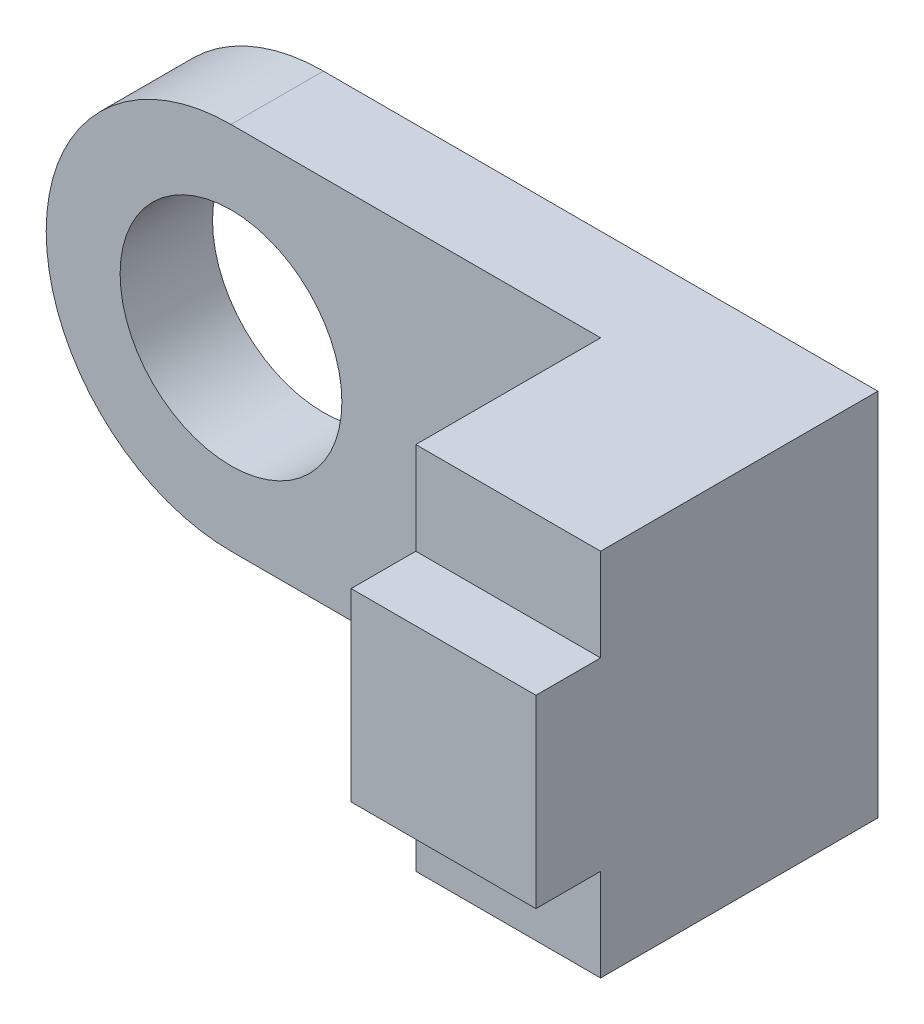
ISO-10303-21;
HEADER;
FILE_DESCRIPTION(('STEP AP214'),'2;1');
FILE_NAME('part.step','',(''),(''),'','','');
FILE_SCHEMA(('AUTOMOTIVE_DESIGN { 1 0 10303 214 1 1 1 1 }'));
ENDSEC;
DATA;
#1=APPLICATION_CONTEXT('core data for automotive mechanical design processes');
#2=APPLICATION_PROTOCOL_DEFINITION('international standard','automotive_design',2000,#1);
#3=PRODUCT_CONTEXT('',#1,'mechanical');
#4=PRODUCT('Part','Part','',(#3));
#5=PRODUCT_RELATED_PRODUCT_CATEGORY('part','',(#4));
#6=PRODUCT_DEFINITION_FORMATION('','',#4);
#7=PRODUCT_DEFINITION_CONTEXT('part definition',#1,'design');
#8=PRODUCT_DEFINITION('design','',#6,#7);
#9=PRODUCT_DEFINITION_SHAPE('','',#8);
#10=(LENGTH_UNIT() NAMED_UNIT(*) SI_UNIT(.MILLI.,.METRE.));
#11=(NAMED_UNIT(*) PLANE_ANGLE_UNIT() SI_UNIT($,.RADIAN.));
#12=(NAMED_UNIT(*) SI_UNIT($,.STERADIAN.) SOLID_ANGLE_UNIT());
#13=UNCERTAINTY_MEASURE_WITH_UNIT(LENGTH_MEASURE(1.E-05),#10,'distance_accuracy_value','');
#14=(GEOMETRIC_REPRESENTATION_CONTEXT(3) GLOBAL_UNCERTAINTY_ASSIGNED_CONTEXT((#13)) GLOBAL_UNIT_ASSIGNED_CONTEXT((#10,
#11,#12)) REPRESENTATION_CONTEXT('',''));
#15=CARTESIAN_POINT('',(0.,0.,0.));
#16=DIRECTION('',(0.,0.,1.));
#17=DIRECTION('',(1.,0.,0.));
#18=AXIS2_PLACEMENT_3D('',#15,#16,#17);
#19=CARTESIAN_POINT('',(0.,0.,30.));
#20=DIRECTION('',(0.,0.,-1.));
#21=DIRECTION('',(-1.,0.,0.));
#22=AXIS2_PLACEMENT_3D('',#19,#20,#21);
#23=PLANE('',#22);
#24=DIRECTION('',(1.,0.,0.));
#25=VECTOR('',#24,1.);
#26=CARTESIAN_POINT('',(30.,-10.,30.));
#27=LINE('',#26,#25);
#28=CARTESIAN_POINT('',(10.,-10.,30.));
#29=VERTEX_POINT('',#28);
#30=CARTESIAN_POINT('',(30.,-10.,30.));
#31=VERTEX_POINT('',#30);
#32=EDGE_CURVE('E48',#29,#31,#27,.T.);
#33=ORIENTED_EDGE('',*,*,#32,.F.);
#34=DIRECTION('',(0.,-1.,0.));
#35=VECTOR('',#34,1.);
#36=CARTESIAN_POINT('',(10.,20.,30.));
#37=LINE('',#36,#35);
#38=CARTESIAN_POINT('',(10.,-20.,30.));
#39=VERTEX_POINT('',#38);
#40=EDGE_CURVE('E145',#29,#39,#37,.T.);
#41=ORIENTED_EDGE('',*,*,#40,.T.);
#42=DIRECTION('',(1.,0.,0.));
#43=VECTOR('',#42,1.);
#44=CARTESIAN_POINT('',(30.,-20.,30.));
#45=LINE('',#44,#43);
#46=CARTESIAN_POINT('',(30.,-20.,30.));
#47=VERTEX_POINT('',#46);
#48=EDGE_CURVE('E148',#39,#47,#45,.T.);
#49=ORIENTED_EDGE('',*,*,#48,.T.);
#50=DIRECTION('',(0.,1.,0.));
#51=VECTOR('',#50,1.);
#52=CARTESIAN_POINT('',(30.,20.,30.));
#53=LINE('',#52,#51);
#54=EDGE_CURVE('E141',#47,#31,#53,.T.);
#55=ORIENTED_EDGE('',*,*,#54,.T.);
#56=EDGE_LOOP('',(#33,#41,#49,#55));
#57=FACE_BOUND('',#56,.T.);
#58=ADVANCED_FACE('F33',(#57),#23,.F.);
#59=DIRECTION('',(-1.,0.,0.));
#60=VECTOR('',#59,1.);
#61=CARTESIAN_POINT('',(30.,10.,30.));
#62=LINE('',#61,#60);
#63=CARTESIAN_POINT('',(30.,10.,30.));
#64=VERTEX_POINT('',#63);
#65=CARTESIAN_POINT('',(10.,10.,30.));
#66=VERTEX_POINT('',#65);
#67=EDGE_CURVE('E56',#64,#66,#62,.T.);
#68=ORIENTED_EDGE('',*,*,#67,.F.);
#69=CARTESIAN_POINT('',(30.,20.,30.));
#70=VERTEX_POINT('',#69);
#71=EDGE_CURVE('E132',#64,#70,#53,.T.);
#72=ORIENTED_EDGE('',*,*,#71,.T.);
#73=DIRECTION('',(-1.,0.,0.));
#74=VECTOR('',#73,1.);
#75=CARTESIAN_POINT('',(30.,20.,30.));
#76=LINE('',#75,#74);
#77=CARTESIAN_POINT('',(10.,20.,30.));
#78=VERTEX_POINT('',#77);
#79=EDGE_CURVE('E143',#70,#78,#76,.T.);
#80=ORIENTED_EDGE('',*,*,#79,.T.);
#81=EDGE_CURVE('E146',#78,#66,#37,.T.);
#82=ORIENTED_EDGE('',*,*,#81,.T.);
#83=EDGE_LOOP('',(#68,#72,#80,#82));
#84=FACE_BOUND('',#83,.T.);
#85=ADVANCED_FACE('F210',(#84),#23,.F.);
#86=CARTESIAN_POINT('',(-30.,0.,10.));
#87=DIRECTION('',(0.,0.,1.));
#88=DIRECTION('',(1.,0.,0.));
#89=AXIS2_PLACEMENT_3D('',#86,#87,#88);
#90=PLANE('',#89);
#91=DIRECTION('',(0.,-1.,0.));
#92=VECTOR('',#91,1.);
#93=CARTESIAN_POINT('',(10.,20.,10.));
#94=LINE('',#93,#92);
#95=CARTESIAN_POINT('',(10.,20.,10.));
#96=VERTEX_POINT('',#95);
#97=CARTESIAN_POINT('',(10.,-20.,10.));
#98=VERTEX_POINT('',#97);
#99=EDGE_CURVE('E133',#96,#98,#94,.T.);
#100=ORIENTED_EDGE('',*,*,#99,.F.);
#101=DIRECTION('',(-1.,0.,0.));
#102=VECTOR('',#101,1.);
#103=CARTESIAN_POINT('',(30.,20.,10.));
#104=LINE('',#103,#102);
#105=CARTESIAN_POINT('',(-30.,20.,10.));
#106=VERTEX_POINT('',#105);
#107=EDGE_CURVE('E170',#96,#106,#104,.T.);
#108=ORIENTED_EDGE('',*,*,#107,.T.);
#109=CARTESIAN_POINT('',(-30.,0.,10.));
#110=DIRECTION('',(0.,0.,1.));
#111=DIRECTION('',(1.,0.,0.));
#112=AXIS2_PLACEMENT_3D('',#109,#110,#111);
#113=CIRCLE('',#112,20.);
#114=CARTESIAN_POINT('',(-30.,-20.,10.));
#115=VERTEX_POINT('',#114);
#116=EDGE_CURVE('E164',#106,#115,#113,.T.);
#117=ORIENTED_EDGE('',*,*,#116,.T.);
#118=DIRECTION('',(1.,0.,0.));
#119=VECTOR('',#118,1.);
#120=CARTESIAN_POINT('',(30.,-20.,10.));
#121=LINE('',#120,#119);
#122=EDGE_CURVE('E167',#115,#98,#121,.T.);
#123=ORIENTED_EDGE('',*,*,#122,.T.);
#124=EDGE_LOOP('',(#100,#108,#117,#123));
#125=FACE_BOUND('',#124,.T.);
#126=CARTESIAN_POINT('',(-30.,0.,10.));
#127=DIRECTION('',(0.,0.,1.));
#128=DIRECTION('',(1.,0.,0.));
#129=AXIS2_PLACEMENT_3D('',#126,#127,#128);
#130=CIRCLE('',#129,12.);
#131=CARTESIAN_POINT('',(-18.,0.,10.));
#132=VERTEX_POINT('',#131);
#133=EDGE_CURVE('E158',#132,#132,#130,.T.);
#134=ORIENTED_EDGE('',*,*,#133,.F.);
#135=EDGE_LOOP('',(#134));
#136=FACE_BOUND('',#135,.T.);
#137=ADVANCED_FACE('F203',(#125,#136),#90,.T.);
#138=CARTESIAN_POINT('',(-30.,0.,0.));
#139=DIRECTION('',(0.,0.,1.));
#140=DIRECTION('',(1.,0.,0.));
#141=AXIS2_PLACEMENT_3D('',#138,#139,#140);
#142=PLANE('',#141);
#143=CARTESIAN_POINT('',(-30.,0.,0.));
#144=DIRECTION('',(0.,0.,1.));
#145=DIRECTION('',(1.,0.,0.));
#146=AXIS2_PLACEMENT_3D('',#143,#144,#145);
#147=CIRCLE('',#146,20.);
#148=CARTESIAN_POINT('',(-30.,20.,0.));
#149=VERTEX_POINT('',#148);
#150=CARTESIAN_POINT('',(-30.,-20.,0.));
#151=VERTEX_POINT('',#150);
#152=EDGE_CURVE('E161',#149,#151,#147,.T.);
#153=ORIENTED_EDGE('',*,*,#152,.F.);
#154=DIRECTION('',(-1.,0.,0.));
#155=VECTOR('',#154,1.);
#156=CARTESIAN_POINT('',(30.,20.,0.));
#157=LINE('',#156,#155);
#158=CARTESIAN_POINT('',(30.,20.,0.));
#159=VERTEX_POINT('',#158);
#160=EDGE_CURVE('E168',#159,#149,#157,.T.);
#161=ORIENTED_EDGE('',*,*,#160,.F.);
#162=DIRECTION('',(0.,1.,0.));
#163=VECTOR('',#162,1.);
#164=CARTESIAN_POINT('',(30.,-20.,0.));
#165=LINE('',#164,#163);
#166=CARTESIAN_POINT('',(30.,-20.,0.));
#167=VERTEX_POINT('',#166);
#168=EDGE_CURVE('E177',#167,#159,#165,.T.);
#169=ORIENTED_EDGE('',*,*,#168,.F.);
#170=DIRECTION('',(1.,0.,0.));
#171=VECTOR('',#170,1.);
#172=CARTESIAN_POINT('',(30.,-20.,0.));
#173=LINE('',#172,#171);
#174=EDGE_CURVE('E175',#151,#167,#173,.T.);
#175=ORIENTED_EDGE('',*,*,#174,.F.);
#176=EDGE_LOOP('',(#153,#161,#169,#175));
#177=FACE_BOUND('',#176,.T.);
#178=CARTESIAN_POINT('',(-30.,0.,0.));
#179=DIRECTION('',(0.,0.,1.));
#180=DIRECTION('',(1.,0.,0.));
#181=AXIS2_PLACEMENT_3D('',#178,#179,#180);
#182=CIRCLE('',#181,12.);
#183=CARTESIAN_POINT('',(-18.,0.,0.));
#184=VERTEX_POINT('',#183);
#185=EDGE_CURVE('E157',#184,#184,#182,.T.);
#186=ORIENTED_EDGE('',*,*,#185,.T.);
#187=EDGE_LOOP('',(#186));
#188=FACE_BOUND('',#187,.T.);
#189=ADVANCED_FACE('F192',(#177,#188),#142,.F.);
#190=CARTESIAN_POINT('',(-30.,0.,10.));
#191=DIRECTION('',(0.,0.,-1.));
#192=DIRECTION('',(-1.,0.,0.));
#193=AXIS2_PLACEMENT_3D('',#190,#191,#192);
#194=CYLINDRICAL_SURFACE('',#193,20.);
#195=ORIENTED_EDGE('',*,*,#152,.T.);
#196=DIRECTION('',(0.,0.,-1.));
#197=VECTOR('',#196,1.);
#198=CARTESIAN_POINT('',(-30.,-20.,10.));
#199=LINE('',#198,#197);
#200=EDGE_CURVE('E11',#115,#151,#199,.T.);
#201=ORIENTED_EDGE('',*,*,#200,.F.);
#202=ORIENTED_EDGE('',*,*,#116,.F.);
#203=DIRECTION('',(0.,0.,-1.));
#204=VECTOR('',#203,1.);
#205=CARTESIAN_POINT('',(-30.,20.,10.));
#206=LINE('',#205,#204);
#207=EDGE_CURVE('E172',#106,#149,#206,.T.);
#208=ORIENTED_EDGE('',*,*,#207,.T.);
#209=EDGE_LOOP('',(#195,#201,#202,#208));
#210=FACE_BOUND('',#209,.T.);
#211=ADVANCED_FACE('F35',(#210),#194,.T.);
#212=CARTESIAN_POINT('',(30.,-20.,10.));
#213=DIRECTION('',(0.,1.,0.));
#214=DIRECTION('',(-1.,0.,0.));
#215=AXIS2_PLACEMENT_3D('',#212,#213,#214);
#216=PLANE('',#215);
#217=ORIENTED_EDGE('',*,*,#174,.T.);
#218=DIRECTION('',(0.,0.,-1.));
#219=VECTOR('',#218,1.);
#220=CARTESIAN_POINT('',(30.,-20.,10.));
#221=LINE('',#220,#219);
#222=EDGE_CURVE('E41',#47,#167,#221,.T.);
#223=ORIENTED_EDGE('',*,*,#222,.F.);
#224=ORIENTED_EDGE('',*,*,#48,.F.);
#225=DIRECTION('',(0.,0.,-1.));
#226=VECTOR('',#225,1.);
#227=CARTESIAN_POINT('',(10.,-20.,30.));
#228=LINE('',#227,#226);
#229=EDGE_CURVE('E150',#39,#98,#228,.T.);
#230=ORIENTED_EDGE('',*,*,#229,.T.);
#231=ORIENTED_EDGE('',*,*,#122,.F.);
#232=ORIENTED_EDGE('',*,*,#200,.T.);
#233=EDGE_LOOP('',(#217,#223,#224,#230,#231,#232));
#234=FACE_BOUND('',#233,.T.);
#235=ADVANCED_FACE('F221',(#234),#216,.F.);
#236=CARTESIAN_POINT('',(30.,-20.,10.));
#237=DIRECTION('',(-1.,0.,0.));
#238=DIRECTION('',(0.,0.,1.));
#239=AXIS2_PLACEMENT_3D('',#236,#237,#238);
#240=PLANE('',#239);
#241=ORIENTED_EDGE('',*,*,#168,.T.);
#242=DIRECTION('',(0.,0.,-1.));
#243=VECTOR('',#242,1.);
#244=CARTESIAN_POINT('',(30.,20.,10.));
#245=LINE('',#244,#243);
#246=EDGE_CURVE('E182',#70,#159,#245,.T.);
#247=ORIENTED_EDGE('',*,*,#246,.F.);
#248=ORIENTED_EDGE('',*,*,#71,.F.);
#249=DIRECTION('',(0.,0.,-1.));
#250=VECTOR('',#249,1.);
#251=CARTESIAN_POINT('',(30.,10.,37.));
#252=LINE('',#251,#250);
#253=CARTESIAN_POINT('',(30.,10.,37.));
#254=VERTEX_POINT('',#253);
#255=EDGE_CURVE('E114',#254,#64,#252,.T.);
#256=ORIENTED_EDGE('',*,*,#255,.F.);
#257=DIRECTION('',(0.,1.,0.));
#258=VECTOR('',#257,1.);
#259=CARTESIAN_POINT('',(30.,10.,37.));
#260=LINE('',#259,#258);
#261=CARTESIAN_POINT('',(30.,-10.,37.));
#262=VERTEX_POINT('',#261);
#263=EDGE_CURVE('E120',#262,#254,#260,.T.);
#264=ORIENTED_EDGE('',*,*,#263,.F.);
#265=DIRECTION('',(0.,0.,-1.));
#266=VECTOR('',#265,1.);
#267=CARTESIAN_POINT('',(30.,-10.,37.));
#268=LINE('',#267,#266);
#269=EDGE_CURVE('E216',#262,#31,#268,.T.);
#270=ORIENTED_EDGE('',*,*,#269,.T.);
#271=ORIENTED_EDGE('',*,*,#54,.F.);
#272=ORIENTED_EDGE('',*,*,#222,.T.);
#273=EDGE_LOOP('',(#241,#247,#248,#256,#264,#270,#271,#272));
#274=FACE_BOUND('',#273,.T.);
#275=ADVANCED_FACE('F130',(#274),#240,.F.);
#276=CARTESIAN_POINT('',(30.,20.,10.));
#277=DIRECTION('',(0.,-1.,0.));
#278=DIRECTION('',(1.,0.,0.));
#279=AXIS2_PLACEMENT_3D('',#276,#277,#278);
#280=PLANE('',#279);
#281=ORIENTED_EDGE('',*,*,#160,.T.);
#282=ORIENTED_EDGE('',*,*,#207,.F.);
#283=ORIENTED_EDGE('',*,*,#107,.F.);
#284=DIRECTION('',(0.,0.,-1.));
#285=VECTOR('',#284,1.);
#286=CARTESIAN_POINT('',(10.,20.,30.));
#287=LINE('',#286,#285);
#288=EDGE_CURVE('E154',#78,#96,#287,.T.);
#289=ORIENTED_EDGE('',*,*,#288,.F.);
#290=ORIENTED_EDGE('',*,*,#79,.F.);
#291=ORIENTED_EDGE('',*,*,#246,.T.);
#292=EDGE_LOOP('',(#281,#282,#283,#289,#290,#291));
#293=FACE_BOUND('',#292,.T.);
#294=ADVANCED_FACE('F196',(#293),#280,.F.);
#295=CARTESIAN_POINT('',(-30.,0.,10.));
#296=DIRECTION('',(0.,0.,-1.));
#297=DIRECTION('',(-1.,0.,0.));
#298=AXIS2_PLACEMENT_3D('',#295,#296,#297);
#299=CYLINDRICAL_SURFACE('',#298,12.);
#300=ORIENTED_EDGE('',*,*,#133,.T.);
#301=EDGE_LOOP('',(#300));
#302=FACE_BOUND('',#301,.T.);
#303=ORIENTED_EDGE('',*,*,#185,.F.);
#304=EDGE_LOOP('',(#303));
#305=FACE_BOUND('',#304,.T.);
#306=ADVANCED_FACE('F238',(#302,#305),#299,.F.);
#307=CARTESIAN_POINT('',(10.,20.,30.));
#308=DIRECTION('',(1.,0.,0.));
#309=DIRECTION('',(0.,1.,0.));
#310=AXIS2_PLACEMENT_3D('',#307,#308,#309);
#311=PLANE('',#310);
#312=ORIENTED_EDGE('',*,*,#99,.T.);
#313=ORIENTED_EDGE('',*,*,#229,.F.);
#314=ORIENTED_EDGE('',*,*,#40,.F.);
#315=DIRECTION('',(0.,0.,-1.));
#316=VECTOR('',#315,1.);
#317=CARTESIAN_POINT('',(10.,-10.,37.));
#318=LINE('',#317,#316);
#319=CARTESIAN_POINT('',(10.,-10.,37.));
#320=VERTEX_POINT('',#319);
#321=EDGE_CURVE('E137',#320,#29,#318,.T.);
#322=ORIENTED_EDGE('',*,*,#321,.F.);
#323=DIRECTION('',(0.,-1.,0.));
#324=VECTOR('',#323,1.);
#325=CARTESIAN_POINT('',(10.,10.,37.));
#326=LINE('',#325,#324);
#327=CARTESIAN_POINT('',(10.,10.,37.));
#328=VERTEX_POINT('',#327);
#329=EDGE_CURVE('E119',#328,#320,#326,.T.);
#330=ORIENTED_EDGE('',*,*,#329,.F.);
#331=DIRECTION('',(0.,0.,-1.));
#332=VECTOR('',#331,1.);
#333=CARTESIAN_POINT('',(10.,10.,37.));
#334=LINE('',#333,#332);
#335=EDGE_CURVE('E116',#328,#66,#334,.T.);
#336=ORIENTED_EDGE('',*,*,#335,.T.);
#337=ORIENTED_EDGE('',*,*,#81,.F.);
#338=ORIENTED_EDGE('',*,*,#288,.T.);
#339=EDGE_LOOP('',(#312,#313,#314,#322,#330,#336,#337,#338));
#340=FACE_BOUND('',#339,.T.);
#341=ADVANCED_FACE('F208',(#340),#311,.F.);
#342=CARTESIAN_POINT('',(30.,10.,37.));
#343=DIRECTION('',(0.,-1.,0.));
#344=DIRECTION('',(1.,0.,0.));
#345=AXIS2_PLACEMENT_3D('',#342,#343,#344);
#346=PLANE('',#345);
#347=ORIENTED_EDGE('',*,*,#67,.T.);
#348=ORIENTED_EDGE('',*,*,#335,.F.);
#349=DIRECTION('',(-1.,0.,0.));
#350=VECTOR('',#349,1.);
#351=CARTESIAN_POINT('',(30.,10.,37.));
#352=LINE('',#351,#350);
#353=EDGE_CURVE('E110',#254,#328,#352,.T.);
#354=ORIENTED_EDGE('',*,*,#353,.F.);
#355=ORIENTED_EDGE('',*,*,#255,.T.);
#356=EDGE_LOOP('',(#347,#348,#354,#355));
#357=FACE_BOUND('',#356,.T.);
#358=ADVANCED_FACE('F112',(#357),#346,.F.);
#359=CARTESIAN_POINT('',(30.,-10.,37.));
#360=DIRECTION('',(0.,1.,0.));
#361=DIRECTION('',(-1.,0.,0.));
#362=AXIS2_PLACEMENT_3D('',#359,#360,#361);
#363=PLANE('',#362);
#364=ORIENTED_EDGE('',*,*,#32,.T.);
#365=ORIENTED_EDGE('',*,*,#269,.F.);
#366=DIRECTION('',(1.,0.,0.));
#367=VECTOR('',#366,1.);
#368=CARTESIAN_POINT('',(30.,-10.,37.));
#369=LINE('',#368,#367);
#370=EDGE_CURVE('E125',#320,#262,#369,.T.);
#371=ORIENTED_EDGE('',*,*,#370,.F.);
#372=ORIENTED_EDGE('',*,*,#321,.T.);
#373=EDGE_LOOP('',(#364,#365,#371,#372));
#374=FACE_BOUND('',#373,.T.);
#375=ADVANCED_FACE('F220',(#374),#363,.F.);
#376=CARTESIAN_POINT('',(0.,0.,37.));
#377=DIRECTION('',(0.,0.,-1.));
#378=DIRECTION('',(-1.,0.,0.));
#379=AXIS2_PLACEMENT_3D('',#376,#377,#378);
#380=PLANE('',#379);
#381=ORIENTED_EDGE('',*,*,#263,.T.);
#382=ORIENTED_EDGE('',*,*,#353,.T.);
#383=ORIENTED_EDGE('',*,*,#329,.T.);
#384=ORIENTED_EDGE('',*,*,#370,.T.);
#385=EDGE_LOOP('',(#381,#382,#383,#384));
#386=FACE_BOUND('',#385,.T.);
#387=ADVANCED_FACE('F123',(#386),#380,.F.);
#388=CLOSED_SHELL('',(#58,#85,#137,#189,#211,#235,#275,#294,#306,#341,#358,#375,#387));
#389=MANIFOLD_SOLID_BREP('B2',#388);
#390=ADVANCED_BREP_SHAPE_REPRESENTATION('',(#18,#389),#14);
#391=SHAPE_DEFINITION_REPRESENTATION(#9,#390);
ENDSEC;
END-ISO-10303-21;
